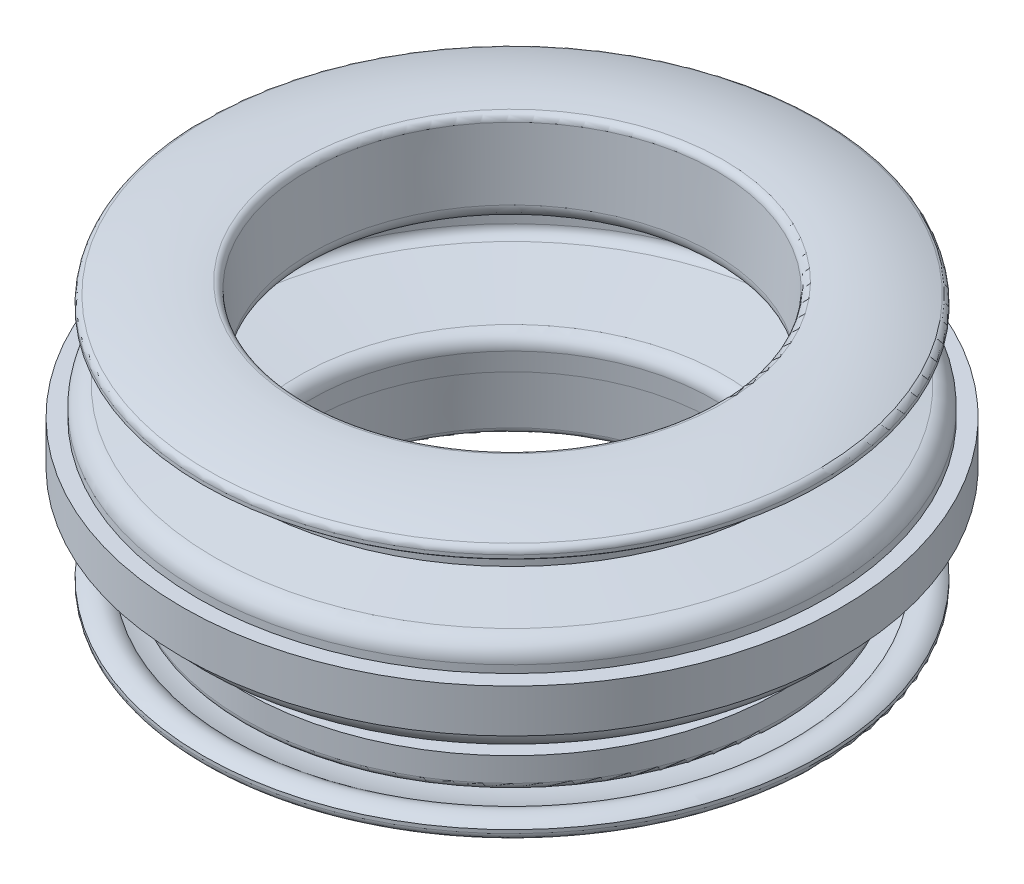
ISO-10303-21;
HEADER;
FILE_DESCRIPTION(('STEP AP214'),'2;1');
FILE_NAME('part.step','',(''),(''),'','','');
FILE_SCHEMA(('AUTOMOTIVE_DESIGN { 1 0 10303 214 1 1 1 1 }'));
ENDSEC;
DATA;
#1=APPLICATION_CONTEXT('core data for automotive mechanical design processes');
#2=APPLICATION_PROTOCOL_DEFINITION('international standard','automotive_design',2000,#1);
#3=PRODUCT_CONTEXT('',#1,'mechanical');
#4=PRODUCT('Part','Part','',(#3));
#5=PRODUCT_RELATED_PRODUCT_CATEGORY('part','',(#4));
#6=PRODUCT_DEFINITION_FORMATION('','',#4);
#7=PRODUCT_DEFINITION_CONTEXT('part definition',#1,'design');
#8=PRODUCT_DEFINITION('design','',#6,#7);
#9=PRODUCT_DEFINITION_SHAPE('','',#8);
#10=(LENGTH_UNIT() NAMED_UNIT(*) SI_UNIT(.MILLI.,.METRE.));
#11=(NAMED_UNIT(*) PLANE_ANGLE_UNIT() SI_UNIT($,.RADIAN.));
#12=(NAMED_UNIT(*) SI_UNIT($,.STERADIAN.) SOLID_ANGLE_UNIT());
#13=UNCERTAINTY_MEASURE_WITH_UNIT(LENGTH_MEASURE(1.E-05),#10,'distance_accuracy_value','');
#14=(GEOMETRIC_REPRESENTATION_CONTEXT(3) GLOBAL_UNCERTAINTY_ASSIGNED_CONTEXT((#13)) GLOBAL_UNIT_ASSIGNED_CONTEXT((#10,
#11,#12)) REPRESENTATION_CONTEXT('',''));
#15=CARTESIAN_POINT('',(0.,0.,0.));
#16=DIRECTION('',(0.,0.,1.));
#17=DIRECTION('',(1.,0.,0.));
#18=AXIS2_PLACEMENT_3D('',#15,#16,#17);
#19=CARTESIAN_POINT('',(0.,-8.08614881640227,0.));
#20=DIRECTION('',(0.,1.,0.));
#21=DIRECTION('',(0.,0.,-1.));
#22=AXIS2_PLACEMENT_3D('',#19,#20,#21);
#23=DEGENERATE_TOROIDAL_SURFACE('',#22,41.247183414883,41.9311614750913,.T.);
#24=CARTESIAN_POINT('',(0.,-47.8006961105615,0.));
#25=DIRECTION('',(0.,-1.,0.));
#26=DIRECTION('',(0.,0.,-1.));
#27=AXIS2_PLACEMENT_3D('',#24,#25,#26);
#28=CIRCLE('',#27,54.6999539797209);
#29=CARTESIAN_POINT('',(0.,-47.8006961105615,-54.6999539797209));
#30=VERTEX_POINT('',#29);
#31=EDGE_CURVE('E53',#30,#30,#28,.F.);
#32=ORIENTED_EDGE('',*,*,#31,.F.);
#33=EDGE_LOOP('',(#32));
#34=FACE_BOUND('',#33,.T.);
#35=CARTESIAN_POINT('',(0.,-49.8867348878114,0.));
#36=DIRECTION('',(0.,-1.,0.));
#37=DIRECTION('',(0.,0.,-1.));
#38=AXIS2_PLACEMENT_3D('',#35,#36,#37);
#39=CIRCLE('',#38,37.9406282986376);
#40=CARTESIAN_POINT('',(0.,-49.8867348878114,-37.9406282986376));
#41=VERTEX_POINT('',#40);
#42=EDGE_CURVE('E65',#41,#41,#39,.T.);
#43=ORIENTED_EDGE('',*,*,#42,.F.);
#44=EDGE_LOOP('',(#43));
#45=FACE_BOUND('',#44,.T.);
#46=ADVANCED_FACE('F42',(#34,#45),#23,.T.);
#47=CARTESIAN_POINT('',(0.,-49.784,0.));
#48=DIRECTION('',(0.,1.,0.));
#49=DIRECTION('',(0.,0.,-1.));
#50=AXIS2_PLACEMENT_3D('',#47,#48,#49);
#51=CYLINDRICAL_SURFACE('',#50,55.5625);
#52=CARTESIAN_POINT('',(0.,-46.5978323383871,0.));
#53=DIRECTION('',(0.,1.,0.));
#54=DIRECTION('',(0.,0.,1.));
#55=AXIS2_PLACEMENT_3D('',#52,#53,#54);
#56=CIRCLE('',#55,55.5625);
#57=CARTESIAN_POINT('',(0.,-46.5978323383871,55.5625));
#58=VERTEX_POINT('',#57);
#59=EDGE_CURVE('E57',#58,#58,#56,.F.);
#60=ORIENTED_EDGE('',*,*,#59,.F.);
#61=EDGE_LOOP('',(#60));
#62=FACE_BOUND('',#61,.T.);
#63=CARTESIAN_POINT('',(0.,-45.974,0.));
#64=DIRECTION('',(0.,-1.,0.));
#65=DIRECTION('',(0.,0.,-1.));
#66=AXIS2_PLACEMENT_3D('',#63,#64,#65);
#67=CIRCLE('',#66,55.5625);
#68=CARTESIAN_POINT('',(0.,-45.974,-55.5625));
#69=VERTEX_POINT('',#68);
#70=EDGE_CURVE('E68',#69,#69,#67,.T.);
#71=ORIENTED_EDGE('',*,*,#70,.T.);
#72=EDGE_LOOP('',(#71));
#73=FACE_BOUND('',#72,.T.);
#74=ADVANCED_FACE('F109',(#62,#73),#51,.T.);
#75=CARTESIAN_POINT('',(0.,-48.8138063314247,0.));
#76=DIRECTION('',(0.,1.,0.));
#77=DIRECTION('',(0.,0.,-1.));
#78=AXIS2_PLACEMENT_3D('',#75,#76,#77);
#79=TOROIDAL_SURFACE('',#78,53.0225,3.81);
#80=ORIENTED_EDGE('',*,*,#70,.F.);
#81=EDGE_LOOP('',(#80));
#82=FACE_BOUND('',#81,.T.);
#83=CARTESIAN_POINT('',(0.,-45.974,0.));
#84=DIRECTION('',(0.,-1.,0.));
#85=DIRECTION('',(0.,0.,-1.));
#86=AXIS2_PLACEMENT_3D('',#83,#84,#85);
#87=CIRCLE('',#86,50.4825);
#88=CARTESIAN_POINT('',(0.,-45.974,-50.4825));
#89=VERTEX_POINT('',#88);
#90=EDGE_CURVE('E75',#89,#89,#87,.T.);
#91=ORIENTED_EDGE('',*,*,#90,.T.);
#92=EDGE_LOOP('',(#91));
#93=FACE_BOUND('',#92,.T.);
#94=ADVANCED_FACE('F114',(#82,#93),#79,.T.);
#95=CARTESIAN_POINT('',(0.,-24.8362895948468,0.));
#96=DIRECTION('',(0.,1.,0.));
#97=DIRECTION('',(0.,0.,-1.));
#98=AXIS2_PLACEMENT_3D('',#95,#96,#97);
#99=TOROIDAL_SURFACE('',#98,43.0459225325699,22.4077104051532);
#100=ORIENTED_EDGE('',*,*,#90,.F.);
#101=EDGE_LOOP('',(#100));
#102=FACE_BOUND('',#101,.T.);
#103=CARTESIAN_POINT('',(0.,-47.244,0.));
#104=DIRECTION('',(0.,-1.,0.));
#105=DIRECTION('',(0.,0.,-1.));
#106=AXIS2_PLACEMENT_3D('',#103,#104,#105);
#107=CIRCLE('',#106,43.0459225325699);
#108=CARTESIAN_POINT('',(0.,-47.244,-43.0459225325699));
#109=VERTEX_POINT('',#108);
#110=EDGE_CURVE('E78',#109,#109,#107,.T.);
#111=ORIENTED_EDGE('',*,*,#110,.T.);
#112=EDGE_LOOP('',(#111));
#113=FACE_BOUND('',#112,.T.);
#114=ADVANCED_FACE('F122',(#102,#113),#99,.F.);
#115=CARTESIAN_POINT('',(0.,-46.228,0.));
#116=DIRECTION('',(0.,1.,0.));
#117=DIRECTION('',(0.,0.,-1.));
#118=AXIS2_PLACEMENT_3D('',#115,#116,#117);
#119=TOROIDAL_SURFACE('',#118,41.91,1.524);
#120=ORIENTED_EDGE('',*,*,#110,.F.);
#121=EDGE_LOOP('',(#120));
#122=FACE_BOUND('',#121,.T.);
#123=CARTESIAN_POINT('',(0.,-45.212,0.));
#124=DIRECTION('',(0.,-1.,0.));
#125=DIRECTION('',(0.,0.,-1.));
#126=AXIS2_PLACEMENT_3D('',#123,#124,#125);
#127=CIRCLE('',#126,43.0459225325699);
#128=CARTESIAN_POINT('',(0.,-45.212,-43.0459225325699));
#129=VERTEX_POINT('',#128);
#130=EDGE_CURVE('E81',#129,#129,#127,.T.);
#131=ORIENTED_EDGE('',*,*,#130,.T.);
#132=EDGE_LOOP('',(#131));
#133=FACE_BOUND('',#132,.T.);
#134=ADVANCED_FACE('F126',(#122,#133),#119,.F.);
#135=CARTESIAN_POINT('',(48.26,-45.212,0.));
#136=DIRECTION('',(0.,-1.,0.));
#137=DIRECTION('',(0.,0.,1.));
#138=AXIS2_PLACEMENT_3D('',#135,#136,#137);
#139=PLANE('',#138);
#140=CARTESIAN_POINT('',(0.,-45.212,0.));
#141=DIRECTION('',(0.,1.,0.));
#142=DIRECTION('',(0.,0.,1.));
#143=AXIS2_PLACEMENT_3D('',#140,#141,#142);
#144=CIRCLE('',#143,46.99);
#145=CARTESIAN_POINT('',(0.,-45.212,46.99));
#146=VERTEX_POINT('',#145);
#147=EDGE_CURVE('E11',#146,#146,#144,.T.);
#148=ORIENTED_EDGE('',*,*,#147,.F.);
#149=EDGE_LOOP('',(#148));
#150=FACE_BOUND('',#149,.T.);
#151=ORIENTED_EDGE('',*,*,#130,.F.);
#152=EDGE_LOOP('',(#151));
#153=FACE_BOUND('',#152,.T.);
#154=ADVANCED_FACE('F130',(#150,#153),#139,.T.);
#155=CARTESIAN_POINT('',(0.,-49.784,0.));
#156=DIRECTION('',(0.,1.,0.));
#157=DIRECTION('',(0.,0.,-1.));
#158=AXIS2_PLACEMENT_3D('',#155,#156,#157);
#159=CYLINDRICAL_SURFACE('',#158,48.26);
#160=CARTESIAN_POINT('',(0.,-43.942,0.));
#161=DIRECTION('',(0.,1.,0.));
#162=DIRECTION('',(0.,0.,1.));
#163=AXIS2_PLACEMENT_3D('',#160,#161,#162);
#164=CIRCLE('',#163,48.26);
#165=CARTESIAN_POINT('',(0.,-43.942,48.26));
#166=VERTEX_POINT('',#165);
#167=EDGE_CURVE('E49',#166,#166,#164,.F.);
#168=ORIENTED_EDGE('',*,*,#167,.F.);
#169=EDGE_LOOP('',(#168));
#170=FACE_BOUND('',#169,.T.);
#171=CARTESIAN_POINT('',(0.,-39.624,0.));
#172=DIRECTION('',(0.,-1.,0.));
#173=DIRECTION('',(0.,0.,-1.));
#174=AXIS2_PLACEMENT_3D('',#171,#172,#173);
#175=CIRCLE('',#174,48.26);
#176=CARTESIAN_POINT('',(0.,-39.624,-48.26));
#177=VERTEX_POINT('',#176);
#178=EDGE_CURVE('E72',#177,#177,#175,.T.);
#179=ORIENTED_EDGE('',*,*,#178,.T.);
#180=EDGE_LOOP('',(#179));
#181=FACE_BOUND('',#180,.T.);
#182=ADVANCED_FACE('F87',(#170,#181),#159,.T.);
#183=CARTESIAN_POINT('',(36.83,-39.624,0.));
#184=DIRECTION('',(0.,1.,0.));
#185=DIRECTION('',(0.,0.,-1.));
#186=AXIS2_PLACEMENT_3D('',#183,#184,#185);
#187=PLANE('',#186);
#188=ORIENTED_EDGE('',*,*,#178,.F.);
#189=EDGE_LOOP('',(#188));
#190=FACE_BOUND('',#189,.T.);
#191=CARTESIAN_POINT('',(0.,-39.624,0.));
#192=DIRECTION('',(0.,-1.,0.));
#193=DIRECTION('',(0.,0.,-1.));
#194=AXIS2_PLACEMENT_3D('',#191,#192,#193);
#195=CIRCLE('',#194,36.2975369624843);
#196=CARTESIAN_POINT('',(0.,-39.624,-36.2975369624843));
#197=VERTEX_POINT('',#196);
#198=EDGE_CURVE('E69',#197,#197,#195,.T.);
#199=ORIENTED_EDGE('',*,*,#198,.T.);
#200=EDGE_LOOP('',(#199));
#201=FACE_BOUND('',#200,.T.);
#202=ADVANCED_FACE('F89',(#190,#201),#187,.T.);
#203=CARTESIAN_POINT('',(0.,-49.784,0.));
#204=DIRECTION('',(0.,-1.,0.));
#205=DIRECTION('',(0.,0.,1.));
#206=AXIS2_PLACEMENT_3D('',#203,#204,#205);
#207=CONICAL_SURFACE('',#206,36.83,0.05235987755983);
#208=CARTESIAN_POINT('',(0.,-48.6871563857552,0.));
#209=DIRECTION('',(0.,-1.,0.));
#210=DIRECTION('',(0.,0.,-1.));
#211=AXIS2_PLACEMENT_3D('',#208,#209,#210);
#212=CIRCLE('',#211,36.7725168619566);
#213=CARTESIAN_POINT('',(0.,-48.6871563857552,-36.7725168619566));
#214=VERTEX_POINT('',#213);
#215=EDGE_CURVE('E62',#214,#214,#212,.F.);
#216=ORIENTED_EDGE('',*,*,#215,.F.);
#217=EDGE_LOOP('',(#216));
#218=FACE_BOUND('',#217,.T.);
#219=ORIENTED_EDGE('',*,*,#198,.F.);
#220=EDGE_LOOP('',(#219));
#221=FACE_BOUND('',#220,.T.);
#222=ADVANCED_FACE('F92',(#218,#221),#207,.F.);
#223=CARTESIAN_POINT('',(0.,-48.6206897213267,0.));
#224=DIRECTION('',(0.,-1.,0.));
#225=DIRECTION('',(0.,0.,1.));
#226=AXIS2_PLACEMENT_3D('',#223,#224,#225);
#227=TOROIDAL_SURFACE('',#226,38.0407763710949,1.27);
#228=ORIENTED_EDGE('',*,*,#215,.T.);
#229=EDGE_LOOP('',(#228));
#230=FACE_BOUND('',#229,.T.);
#231=ORIENTED_EDGE('',*,*,#42,.T.);
#232=EDGE_LOOP('',(#231));
#233=FACE_BOUND('',#232,.T.);
#234=ADVANCED_FACE('F97',(#230,#233),#227,.T.);
#235=CARTESIAN_POINT('',(0.,-46.5978323383871,0.));
#236=DIRECTION('',(0.,-1.,0.));
#237=DIRECTION('',(0.,0.,1.));
#238=AXIS2_PLACEMENT_3D('',#235,#236,#237);
#239=TOROIDAL_SURFACE('',#238,54.2925,1.27);
#240=ORIENTED_EDGE('',*,*,#31,.T.);
#241=EDGE_LOOP('',(#240));
#242=FACE_BOUND('',#241,.T.);
#243=ORIENTED_EDGE('',*,*,#59,.T.);
#244=EDGE_LOOP('',(#243));
#245=FACE_BOUND('',#244,.T.);
#246=ADVANCED_FACE('F103',(#242,#245),#239,.T.);
#247=CARTESIAN_POINT('',(0.,-43.942,0.));
#248=DIRECTION('',(0.,-1.,0.));
#249=DIRECTION('',(0.,0.,1.));
#250=AXIS2_PLACEMENT_3D('',#247,#248,#249);
#251=TOROIDAL_SURFACE('',#250,46.99,1.27);
#252=ORIENTED_EDGE('',*,*,#147,.T.);
#253=EDGE_LOOP('',(#252));
#254=FACE_BOUND('',#253,.T.);
#255=ORIENTED_EDGE('',*,*,#167,.T.);
#256=EDGE_LOOP('',(#255));
#257=FACE_BOUND('',#256,.T.);
#258=ADVANCED_FACE('F44',(#254,#257),#251,.T.);
#259=CLOSED_SHELL('',(#46,#74,#94,#114,#134,#154,#182,#202,#222,#234,#246,#258));
#260=MANIFOLD_SOLID_BREP('B2',#259);
#261=CARTESIAN_POINT('',(0.,-41.6978511835977,0.));
#262=DIRECTION('',(0.,-1.,0.));
#263=DIRECTION('',(0.,0.,-1.));
#264=AXIS2_PLACEMENT_3D('',#261,#262,#263);
#265=DEGENERATE_TOROIDAL_SURFACE('',#264,41.247183414883,41.9311614750913,.T.);
#266=CARTESIAN_POINT('',(0.,-1.98330388943848,0.));
#267=DIRECTION('',(0.,-1.,0.));
#268=DIRECTION('',(0.,0.,-1.));
#269=AXIS2_PLACEMENT_3D('',#266,#267,#268);
#270=CIRCLE('',#269,54.6999539797209);
#271=CARTESIAN_POINT('',(0.,-1.98330388943848,-54.6999539797209));
#272=VERTEX_POINT('',#271);
#273=EDGE_CURVE('E238',#272,#272,#270,.F.);
#274=ORIENTED_EDGE('',*,*,#273,.T.);
#275=EDGE_LOOP('',(#274));
#276=FACE_BOUND('',#275,.T.);
#277=CARTESIAN_POINT('',(0.,0.102734887811352,0.));
#278=DIRECTION('',(0.,-1.,0.));
#279=DIRECTION('',(0.,0.,-1.));
#280=AXIS2_PLACEMENT_3D('',#277,#278,#279);
#281=CIRCLE('',#280,37.9406282986376);
#282=CARTESIAN_POINT('',(0.,0.102734887811352,-37.9406282986376));
#283=VERTEX_POINT('',#282);
#284=EDGE_CURVE('E249',#283,#283,#281,.T.);
#285=ORIENTED_EDGE('',*,*,#284,.T.);
#286=EDGE_LOOP('',(#285));
#287=FACE_BOUND('',#286,.T.);
#288=ADVANCED_FACE('F223',(#276,#287),#265,.T.);
#289=CARTESIAN_POINT('',(0.,0.,0.));
#290=DIRECTION('',(0.,-1.,0.));
#291=DIRECTION('',(0.,0.,-1.));
#292=AXIS2_PLACEMENT_3D('',#289,#290,#291);
#293=CYLINDRICAL_SURFACE('',#292,55.5625);
#294=CARTESIAN_POINT('',(0.,-3.18616766161288,0.));
#295=DIRECTION('',(0.,1.,0.));
#296=DIRECTION('',(0.,0.,1.));
#297=AXIS2_PLACEMENT_3D('',#294,#295,#296);
#298=CIRCLE('',#297,55.5625);
#299=CARTESIAN_POINT('',(0.,-3.18616766161288,55.5625));
#300=VERTEX_POINT('',#299);
#301=EDGE_CURVE('E243',#300,#300,#298,.F.);
#302=ORIENTED_EDGE('',*,*,#301,.T.);
#303=EDGE_LOOP('',(#302));
#304=FACE_BOUND('',#303,.T.);
#305=CARTESIAN_POINT('',(0.,-3.81,0.));
#306=DIRECTION('',(0.,-1.,0.));
#307=DIRECTION('',(0.,0.,-1.));
#308=AXIS2_PLACEMENT_3D('',#305,#306,#307);
#309=CIRCLE('',#308,55.5625);
#310=CARTESIAN_POINT('',(0.,-3.81,-55.5625));
#311=VERTEX_POINT('',#310);
#312=EDGE_CURVE('E252',#311,#311,#309,.T.);
#313=ORIENTED_EDGE('',*,*,#312,.F.);
#314=EDGE_LOOP('',(#313));
#315=FACE_BOUND('',#314,.T.);
#316=ADVANCED_FACE('F418',(#304,#315),#293,.T.);
#317=CARTESIAN_POINT('',(0.,-0.970193668575267,0.));
#318=DIRECTION('',(0.,-1.,0.));
#319=DIRECTION('',(0.,0.,-1.));
#320=AXIS2_PLACEMENT_3D('',#317,#318,#319);
#321=TOROIDAL_SURFACE('',#320,53.0225,3.81);
#322=ORIENTED_EDGE('',*,*,#312,.T.);
#323=EDGE_LOOP('',(#322));
#324=FACE_BOUND('',#323,.T.);
#325=CARTESIAN_POINT('',(0.,-3.81,0.));
#326=DIRECTION('',(0.,-1.,0.));
#327=DIRECTION('',(0.,0.,-1.));
#328=AXIS2_PLACEMENT_3D('',#325,#326,#327);
#329=CIRCLE('',#328,50.4825);
#330=CARTESIAN_POINT('',(0.,-3.81,-50.4825));
#331=VERTEX_POINT('',#330);
#332=EDGE_CURVE('E255',#331,#331,#329,.T.);
#333=ORIENTED_EDGE('',*,*,#332,.F.);
#334=EDGE_LOOP('',(#333));
#335=FACE_BOUND('',#334,.T.);
#336=ADVANCED_FACE('F424',(#324,#335),#321,.T.);
#337=CARTESIAN_POINT('',(0.,-24.9477104051532,0.));
#338=DIRECTION('',(0.,-1.,0.));
#339=DIRECTION('',(0.,0.,-1.));
#340=AXIS2_PLACEMENT_3D('',#337,#338,#339);
#341=TOROIDAL_SURFACE('',#340,43.0459225325699,22.4077104051532);
#342=ORIENTED_EDGE('',*,*,#332,.T.);
#343=EDGE_LOOP('',(#342));
#344=FACE_BOUND('',#343,.T.);
#345=CARTESIAN_POINT('',(0.,-2.54,0.));
#346=DIRECTION('',(0.,-1.,0.));
#347=DIRECTION('',(0.,0.,-1.));
#348=AXIS2_PLACEMENT_3D('',#345,#346,#347);
#349=CIRCLE('',#348,43.0459225325699);
#350=CARTESIAN_POINT('',(0.,-2.54,-43.0459225325699));
#351=VERTEX_POINT('',#350);
#352=EDGE_CURVE('E258',#351,#351,#349,.T.);
#353=ORIENTED_EDGE('',*,*,#352,.F.);
#354=EDGE_LOOP('',(#353));
#355=FACE_BOUND('',#354,.T.);
#356=ADVANCED_FACE('F453',(#344,#355),#341,.F.);
#357=CARTESIAN_POINT('',(0.,-3.556,0.));
#358=DIRECTION('',(0.,-1.,0.));
#359=DIRECTION('',(0.,0.,-1.));
#360=AXIS2_PLACEMENT_3D('',#357,#358,#359);
#361=TOROIDAL_SURFACE('',#360,41.91,1.524);
#362=ORIENTED_EDGE('',*,*,#352,.T.);
#363=EDGE_LOOP('',(#362));
#364=FACE_BOUND('',#363,.T.);
#365=CARTESIAN_POINT('',(0.,-4.572,0.));
#366=DIRECTION('',(0.,-1.,0.));
#367=DIRECTION('',(0.,0.,-1.));
#368=AXIS2_PLACEMENT_3D('',#365,#366,#367);
#369=CIRCLE('',#368,43.0459225325699);
#370=CARTESIAN_POINT('',(0.,-4.572,-43.0459225325699));
#371=VERTEX_POINT('',#370);
#372=EDGE_CURVE('E261',#371,#371,#369,.T.);
#373=ORIENTED_EDGE('',*,*,#372,.F.);
#374=EDGE_LOOP('',(#373));
#375=FACE_BOUND('',#374,.T.);
#376=ADVANCED_FACE('F458',(#364,#375),#361,.F.);
#377=CARTESIAN_POINT('',(48.26,-4.572,0.));
#378=DIRECTION('',(0.,1.,0.));
#379=DIRECTION('',(0.,0.,1.));
#380=AXIS2_PLACEMENT_3D('',#377,#378,#379);
#381=PLANE('',#380);
#382=CARTESIAN_POINT('',(0.,-4.572,0.));
#383=DIRECTION('',(0.,1.,0.));
#384=DIRECTION('',(0.,0.,1.));
#385=AXIS2_PLACEMENT_3D('',#382,#383,#384);
#386=CIRCLE('',#385,46.99);
#387=CARTESIAN_POINT('',(0.,-4.572,46.99));
#388=VERTEX_POINT('',#387);
#389=EDGE_CURVE('E230',#388,#388,#386,.T.);
#390=ORIENTED_EDGE('',*,*,#389,.T.);
#391=EDGE_LOOP('',(#390));
#392=FACE_BOUND('',#391,.T.);
#393=ORIENTED_EDGE('',*,*,#372,.T.);
#394=EDGE_LOOP('',(#393));
#395=FACE_BOUND('',#394,.T.);
#396=ADVANCED_FACE('F464',(#392,#395),#381,.T.);
#397=CARTESIAN_POINT('',(0.,0.,0.));
#398=DIRECTION('',(0.,-1.,0.));
#399=DIRECTION('',(0.,0.,-1.));
#400=AXIS2_PLACEMENT_3D('',#397,#398,#399);
#401=CYLINDRICAL_SURFACE('',#400,48.26);
#402=CARTESIAN_POINT('',(0.,-5.842,0.));
#403=DIRECTION('',(0.,1.,0.));
#404=DIRECTION('',(0.,0.,1.));
#405=AXIS2_PLACEMENT_3D('',#402,#403,#404);
#406=CIRCLE('',#405,48.26);
#407=CARTESIAN_POINT('',(0.,-5.842,48.26));
#408=VERTEX_POINT('',#407);
#409=EDGE_CURVE('E234',#408,#408,#406,.F.);
#410=ORIENTED_EDGE('',*,*,#409,.T.);
#411=EDGE_LOOP('',(#410));
#412=FACE_BOUND('',#411,.T.);
#413=CARTESIAN_POINT('',(0.,-10.16,0.));
#414=DIRECTION('',(0.,-1.,0.));
#415=DIRECTION('',(0.,0.,-1.));
#416=AXIS2_PLACEMENT_3D('',#413,#414,#415);
#417=CIRCLE('',#416,48.26);
#418=CARTESIAN_POINT('',(0.,-10.16,-48.26));
#419=VERTEX_POINT('',#418);
#420=EDGE_CURVE('E264',#419,#419,#417,.T.);
#421=ORIENTED_EDGE('',*,*,#420,.F.);
#422=EDGE_LOOP('',(#421));
#423=FACE_BOUND('',#422,.T.);
#424=ADVANCED_FACE('F469',(#412,#423),#401,.T.);
#425=CARTESIAN_POINT('',(36.83,-10.16,0.));
#426=DIRECTION('',(0.,-1.,0.));
#427=DIRECTION('',(0.,0.,-1.));
#428=AXIS2_PLACEMENT_3D('',#425,#426,#427);
#429=PLANE('',#428);
#430=CARTESIAN_POINT('',(0.,-10.16,0.));
#431=DIRECTION('',(0.,-1.,0.));
#432=DIRECTION('',(0.,0.,-1.));
#433=AXIS2_PLACEMENT_3D('',#430,#431,#432);
#434=CIRCLE('',#433,38.8375369624843);
#435=CARTESIAN_POINT('',(0.,-10.16,-38.8375369624843));
#436=VERTEX_POINT('',#435);
#437=EDGE_CURVE('E41',#436,#436,#434,.T.);
#438=ORIENTED_EDGE('',*,*,#437,.F.);
#439=EDGE_LOOP('',(#438));
#440=FACE_BOUND('',#439,.T.);
#441=ORIENTED_EDGE('',*,*,#420,.T.);
#442=EDGE_LOOP('',(#441));
#443=FACE_BOUND('',#442,.T.);
#444=ADVANCED_FACE('F434',(#440,#443),#429,.T.);
#445=CARTESIAN_POINT('',(0.,0.,0.));
#446=DIRECTION('',(0.,1.,0.));
#447=DIRECTION('',(0.,0.,1.));
#448=AXIS2_PLACEMENT_3D('',#445,#446,#447);
#449=CONICAL_SURFACE('',#448,36.83,0.05235987755983);
#450=CARTESIAN_POINT('',(0.,-1.09684361424478,0.));
#451=DIRECTION('',(0.,-1.,0.));
#452=DIRECTION('',(0.,0.,-1.));
#453=AXIS2_PLACEMENT_3D('',#450,#451,#452);
#454=CIRCLE('',#453,36.7725168619566);
#455=CARTESIAN_POINT('',(0.,-1.09684361424478,-36.7725168619566));
#456=VERTEX_POINT('',#455);
#457=EDGE_CURVE('E246',#456,#456,#454,.F.);
#458=ORIENTED_EDGE('',*,*,#457,.T.);
#459=EDGE_LOOP('',(#458));
#460=FACE_BOUND('',#459,.T.);
#461=CARTESIAN_POINT('',(0.,-13.5156304286955,0.));
#462=DIRECTION('',(0.,1.,0.));
#463=DIRECTION('',(0.,0.,1.));
#464=AXIS2_PLACEMENT_3D('',#461,#462,#463);
#465=CIRCLE('',#464,36.1216758236218);
#466=CARTESIAN_POINT('',(0.,-13.5156304286955,36.1216758236218));
#467=VERTEX_POINT('',#466);
#468=EDGE_CURVE('E276',#467,#467,#465,.T.);
#469=ORIENTED_EDGE('',*,*,#468,.F.);
#470=EDGE_LOOP('',(#469));
#471=FACE_BOUND('',#470,.T.);
#472=ADVANCED_FACE('F430',(#460,#471),#449,.F.);
#473=CARTESIAN_POINT('',(0.,-1.16331027867326,0.));
#474=DIRECTION('',(0.,1.,0.));
#475=DIRECTION('',(0.,0.,1.));
#476=AXIS2_PLACEMENT_3D('',#473,#474,#475);
#477=TOROIDAL_SURFACE('',#476,38.0407763710949,1.27);
#478=ORIENTED_EDGE('',*,*,#457,.F.);
#479=EDGE_LOOP('',(#478));
#480=FACE_BOUND('',#479,.T.);
#481=ORIENTED_EDGE('',*,*,#284,.F.);
#482=EDGE_LOOP('',(#481));
#483=FACE_BOUND('',#482,.T.);
#484=ADVANCED_FACE('F433',(#480,#483),#477,.T.);
#485=CARTESIAN_POINT('',(0.,-3.18616766161288,0.));
#486=DIRECTION('',(0.,1.,0.));
#487=DIRECTION('',(0.,0.,1.));
#488=AXIS2_PLACEMENT_3D('',#485,#486,#487);
#489=TOROIDAL_SURFACE('',#488,54.2925,1.27);
#490=ORIENTED_EDGE('',*,*,#273,.F.);
#491=EDGE_LOOP('',(#490));
#492=FACE_BOUND('',#491,.T.);
#493=ORIENTED_EDGE('',*,*,#301,.F.);
#494=EDGE_LOOP('',(#493));
#495=FACE_BOUND('',#494,.T.);
#496=ADVANCED_FACE('F437',(#492,#495),#489,.T.);
#497=CARTESIAN_POINT('',(0.,-5.842,0.));
#498=DIRECTION('',(0.,1.,0.));
#499=DIRECTION('',(0.,0.,1.));
#500=AXIS2_PLACEMENT_3D('',#497,#498,#499);
#501=TOROIDAL_SURFACE('',#500,46.99,1.27);
#502=ORIENTED_EDGE('',*,*,#389,.F.);
#503=EDGE_LOOP('',(#502));
#504=FACE_BOUND('',#503,.T.);
#505=ORIENTED_EDGE('',*,*,#409,.F.);
#506=EDGE_LOOP('',(#505));
#507=FACE_BOUND('',#506,.T.);
#508=ADVANCED_FACE('F225',(#504,#507),#501,.T.);
#509=CARTESIAN_POINT('',(0.,0.,0.));
#510=DIRECTION('',(0.,1.,0.));
#511=DIRECTION('',(0.,0.,1.));
#512=AXIS2_PLACEMENT_3D('',#509,#510,#511);
#513=CYLINDRICAL_SURFACE('',#512,59.2604292563378);
#514=CARTESIAN_POINT('',(0.,-21.0051938165436,0.));
#515=DIRECTION('',(0.,1.,0.));
#516=DIRECTION('',(0.,0.,1.));
#517=AXIS2_PLACEMENT_3D('',#514,#515,#516);
#518=CIRCLE('',#517,59.2604292563378);
#519=CARTESIAN_POINT('',(0.,-21.0051938165436,59.2604292563378));
#520=VERTEX_POINT('',#519);
#521=EDGE_CURVE('E294',#520,#520,#518,.T.);
#522=ORIENTED_EDGE('',*,*,#521,.F.);
#523=EDGE_LOOP('',(#522));
#524=FACE_BOUND('',#523,.T.);
#525=CARTESIAN_POINT('',(0.,-28.7788061834564,0.));
#526=DIRECTION('',(0.,1.,0.));
#527=DIRECTION('',(0.,0.,1.));
#528=AXIS2_PLACEMENT_3D('',#525,#526,#527);
#529=CIRCLE('',#528,59.2604292563378);
#530=CARTESIAN_POINT('',(0.,-28.7788061834564,59.2604292563378));
#531=VERTEX_POINT('',#530);
#532=EDGE_CURVE('E330',#531,#531,#529,.T.);
#533=ORIENTED_EDGE('',*,*,#532,.T.);
#534=EDGE_LOOP('',(#533));
#535=FACE_BOUND('',#534,.T.);
#536=ADVANCED_FACE('F334',(#524,#535),#513,.T.);
#537=CARTESIAN_POINT('',(0.,0.,0.));
#538=DIRECTION('',(0.,1.,0.));
#539=DIRECTION('',(0.,0.,1.));
#540=AXIS2_PLACEMENT_3D('',#537,#538,#539);
#541=CYLINDRICAL_SURFACE('',#540,54.5175579136274);
#542=CARTESIAN_POINT('',(0.,-20.3326467556144,0.));
#543=DIRECTION('',(0.,1.,0.));
#544=DIRECTION('',(0.,0.,1.));
#545=AXIS2_PLACEMENT_3D('',#542,#543,#544);
#546=CIRCLE('',#545,54.5175579136274);
#547=CARTESIAN_POINT('',(0.,-20.3326467556144,54.5175579136274));
#548=VERTEX_POINT('',#547);
#549=EDGE_CURVE('E267',#548,#548,#546,.T.);
#550=ORIENTED_EDGE('',*,*,#549,.T.);
#551=EDGE_LOOP('',(#550));
#552=FACE_BOUND('',#551,.T.);
#553=CARTESIAN_POINT('',(0.,-29.4513532443856,0.));
#554=DIRECTION('',(0.,1.,0.));
#555=DIRECTION('',(0.,0.,1.));
#556=AXIS2_PLACEMENT_3D('',#553,#554,#555);
#557=CIRCLE('',#556,54.5175579136274);
#558=CARTESIAN_POINT('',(0.,-29.4513532443856,54.5175579136274));
#559=VERTEX_POINT('',#558);
#560=EDGE_CURVE('E297',#559,#559,#557,.T.);
#561=ORIENTED_EDGE('',*,*,#560,.F.);
#562=EDGE_LOOP('',(#561));
#563=FACE_BOUND('',#562,.T.);
#564=ADVANCED_FACE('F403',(#552,#563),#541,.F.);
#565=CARTESIAN_POINT('',(0.,-20.3326467556144,0.));
#566=DIRECTION('',(0.,1.,0.));
#567=DIRECTION('',(0.,0.,1.));
#568=AXIS2_PLACEMENT_3D('',#565,#566,#567);
#569=TOROIDAL_SURFACE('',#568,52.7669659205668,1.75059199306054);
#570=CARTESIAN_POINT('',(0.,-18.6055501848726,0.));
#571=DIRECTION('',(0.,1.,0.));
#572=DIRECTION('',(0.,0.,1.));
#573=AXIS2_PLACEMENT_3D('',#570,#571,#572);
#574=CIRCLE('',#573,53.052815114198);
#575=CARTESIAN_POINT('',(0.,-18.6055501848726,53.052815114198));
#576=VERTEX_POINT('',#575);
#577=EDGE_CURVE('E270',#576,#576,#574,.T.);
#578=ORIENTED_EDGE('',*,*,#577,.T.);
#579=EDGE_LOOP('',(#578));
#580=FACE_BOUND('',#579,.T.);
#581=ORIENTED_EDGE('',*,*,#549,.F.);
#582=EDGE_LOOP('',(#581));
#583=FACE_BOUND('',#582,.T.);
#584=ADVANCED_FACE('F405',(#580,#583),#569,.F.);
#585=CARTESIAN_POINT('',(0.,-18.6055501848726,0.));
#586=DIRECTION('',(0.,-1.,0.));
#587=DIRECTION('',(0.,0.,-1.));
#588=AXIS2_PLACEMENT_3D('',#585,#586,#587);
#589=CONICAL_SURFACE('',#588,53.052815114198,1.4067747080575);
#590=CARTESIAN_POINT('',(0.,-16.1544733624598,0.));
#591=DIRECTION('',(0.,1.,0.));
#592=DIRECTION('',(0.,0.,1.));
#593=AXIS2_PLACEMENT_3D('',#590,#591,#592);
#594=CIRCLE('',#593,38.2434454572894);
#595=CARTESIAN_POINT('',(0.,-16.1544733624598,38.2434454572894));
#596=VERTEX_POINT('',#595);
#597=EDGE_CURVE('E273',#596,#596,#594,.T.);
#598=ORIENTED_EDGE('',*,*,#597,.T.);
#599=EDGE_LOOP('',(#598));
#600=FACE_BOUND('',#599,.T.);
#601=ORIENTED_EDGE('',*,*,#577,.F.);
#602=EDGE_LOOP('',(#601));
#603=FACE_BOUND('',#602,.T.);
#604=ADVANCED_FACE('F412',(#600,#603),#589,.F.);
#605=CARTESIAN_POINT('',(0.,-13.6485637575525,0.));
#606=DIRECTION('',(0.,1.,0.));
#607=DIRECTION('',(0.,0.,1.));
#608=AXIS2_PLACEMENT_3D('',#605,#606,#607);
#609=TOROIDAL_SURFACE('',#608,38.6581948418984,2.54);
#610=ORIENTED_EDGE('',*,*,#468,.T.);
#611=EDGE_LOOP('',(#610));
#612=FACE_BOUND('',#611,.T.);
#613=ORIENTED_EDGE('',*,*,#597,.F.);
#614=EDGE_LOOP('',(#613));
#615=FACE_BOUND('',#614,.T.);
#616=ADVANCED_FACE('F655',(#612,#615),#609,.T.);
#617=CARTESIAN_POINT('',(0.,0.,0.));
#618=DIRECTION('',(0.,1.,0.));
#619=DIRECTION('',(0.,0.,1.));
#620=AXIS2_PLACEMENT_3D('',#617,#618,#619);
#621=CYLINDRICAL_SURFACE('',#620,38.8375369624843);
#622=CARTESIAN_POINT('',(0.,-12.0626245120228,0.));
#623=DIRECTION('',(0.,1.,0.));
#624=DIRECTION('',(0.,0.,1.));
#625=AXIS2_PLACEMENT_3D('',#622,#623,#624);
#626=CIRCLE('',#625,38.8375369624843);
#627=CARTESIAN_POINT('',(0.,-12.0626245120228,38.8375369624843));
#628=VERTEX_POINT('',#627);
#629=EDGE_CURVE('E279',#628,#628,#626,.T.);
#630=ORIENTED_EDGE('',*,*,#629,.T.);
#631=EDGE_LOOP('',(#630));
#632=FACE_BOUND('',#631,.T.);
#633=ORIENTED_EDGE('',*,*,#437,.T.);
#634=EDGE_LOOP('',(#633));
#635=FACE_BOUND('',#634,.T.);
#636=ADVANCED_FACE('F647',(#632,#635),#621,.T.);
#637=CARTESIAN_POINT('',(0.,-12.0626245120228,0.));
#638=DIRECTION('',(0.,1.,0.));
#639=DIRECTION('',(0.,0.,1.));
#640=AXIS2_PLACEMENT_3D('',#637,#638,#639);
#641=TOROIDAL_SURFACE('',#640,40.7425369624843,1.905);
#642=CARTESIAN_POINT('',(0.,-13.9420567157032,0.));
#643=DIRECTION('',(0.,1.,0.));
#644=DIRECTION('',(0.,0.,1.));
#645=AXIS2_PLACEMENT_3D('',#642,#643,#644);
#646=CIRCLE('',#645,40.4314749240276);
#647=CARTESIAN_POINT('',(0.,-13.9420567157032,40.4314749240276));
#648=VERTEX_POINT('',#647);
#649=EDGE_CURVE('E282',#648,#648,#646,.T.);
#650=ORIENTED_EDGE('',*,*,#649,.T.);
#651=EDGE_LOOP('',(#650));
#652=FACE_BOUND('',#651,.T.);
#653=ORIENTED_EDGE('',*,*,#629,.F.);
#654=EDGE_LOOP('',(#653));
#655=FACE_BOUND('',#654,.T.);
#656=ADVANCED_FACE('F639',(#652,#655),#641,.F.);
#657=CARTESIAN_POINT('',(0.,-13.9420567157032,0.));
#658=DIRECTION('',(0.,-1.,0.));
#659=DIRECTION('',(0.,0.,-1.));
#660=AXIS2_PLACEMENT_3D('',#657,#658,#659);
#661=CONICAL_SURFACE('',#660,40.4314749240276,1.4067747080575);
#662=CARTESIAN_POINT('',(0.,-16.104875129868,0.));
#663=DIRECTION('',(0.,1.,0.));
#664=DIRECTION('',(0.,0.,1.));
#665=AXIS2_PLACEMENT_3D('',#662,#663,#664);
#666=CIRCLE('',#665,53.4991915713602);
#667=CARTESIAN_POINT('',(0.,-16.104875129868,53.4991915713602));
#668=VERTEX_POINT('',#667);
#669=EDGE_CURVE('E285',#668,#668,#666,.T.);
#670=ORIENTED_EDGE('',*,*,#669,.T.);
#671=EDGE_LOOP('',(#670));
#672=FACE_BOUND('',#671,.T.);
#673=ORIENTED_EDGE('',*,*,#649,.F.);
#674=EDGE_LOOP('',(#673));
#675=FACE_BOUND('',#674,.T.);
#676=ADVANCED_FACE('F631',(#672,#675),#661,.T.);
#677=CARTESIAN_POINT('',(0.,-19.6371157406611,0.));
#678=DIRECTION('',(0.,1.,0.));
#679=DIRECTION('',(0.,0.,1.));
#680=AXIS2_PLACEMENT_3D('',#677,#678,#679);
#681=TOROIDAL_SURFACE('',#680,52.9145756631293,3.58029321322894);
#682=CARTESIAN_POINT('',(0.,-19.6371157406611,0.));
#683=DIRECTION('',(0.,1.,0.));
#684=DIRECTION('',(0.,0.,1.));
#685=AXIS2_PLACEMENT_3D('',#682,#683,#684);
#686=CIRCLE('',#685,56.4948688763583);
#687=CARTESIAN_POINT('',(0.,-19.6371157406611,56.4948688763583));
#688=VERTEX_POINT('',#687);
#689=EDGE_CURVE('E288',#688,#688,#686,.T.);
#690=ORIENTED_EDGE('',*,*,#689,.T.);
#691=EDGE_LOOP('',(#690));
#692=FACE_BOUND('',#691,.T.);
#693=ORIENTED_EDGE('',*,*,#669,.F.);
#694=EDGE_LOOP('',(#693));
#695=FACE_BOUND('',#694,.T.);
#696=ADVANCED_FACE('F623',(#692,#695),#681,.T.);
#697=CARTESIAN_POINT('',(0.,0.,0.));
#698=DIRECTION('',(0.,1.,0.));
#699=DIRECTION('',(0.,0.,1.));
#700=AXIS2_PLACEMENT_3D('',#697,#698,#699);
#701=CYLINDRICAL_SURFACE('',#700,56.4948688763583);
#702=CARTESIAN_POINT('',(0.,-21.0051938165436,0.));
#703=DIRECTION('',(0.,1.,0.));
#704=DIRECTION('',(0.,0.,1.));
#705=AXIS2_PLACEMENT_3D('',#702,#703,#704);
#706=CIRCLE('',#705,56.4948688763583);
#707=CARTESIAN_POINT('',(0.,-21.0051938165436,56.4948688763583));
#708=VERTEX_POINT('',#707);
#709=EDGE_CURVE('E291',#708,#708,#706,.T.);
#710=ORIENTED_EDGE('',*,*,#709,.T.);
#711=EDGE_LOOP('',(#710));
#712=FACE_BOUND('',#711,.T.);
#713=ORIENTED_EDGE('',*,*,#689,.F.);
#714=EDGE_LOOP('',(#713));
#715=FACE_BOUND('',#714,.T.);
#716=ADVANCED_FACE('F618',(#712,#715),#701,.T.);
#717=CARTESIAN_POINT('',(-56.4948688763583,-21.0051938165436,0.));
#718=DIRECTION('',(0.,1.,0.));
#719=DIRECTION('',(0.,0.,1.));
#720=AXIS2_PLACEMENT_3D('',#717,#718,#719);
#721=PLANE('',#720);
#722=ORIENTED_EDGE('',*,*,#521,.T.);
#723=EDGE_LOOP('',(#722));
#724=FACE_BOUND('',#723,.T.);
#725=ORIENTED_EDGE('',*,*,#709,.F.);
#726=EDGE_LOOP('',(#725));
#727=FACE_BOUND('',#726,.T.);
#728=ADVANCED_FACE('F399',(#724,#727),#721,.T.);
#729=CARTESIAN_POINT('',(0.,-29.4513532443856,0.));
#730=DIRECTION('',(0.,-1.,0.));
#731=DIRECTION('',(0.,0.,1.));
#732=AXIS2_PLACEMENT_3D('',#729,#730,#731);
#733=TOROIDAL_SURFACE('',#732,52.7669659205668,1.75059199306054);
#734=CARTESIAN_POINT('',(0.,-31.1784498151274,0.));
#735=DIRECTION('',(0.,1.,0.));
#736=DIRECTION('',(0.,0.,1.));
#737=AXIS2_PLACEMENT_3D('',#734,#735,#736);
#738=CIRCLE('',#737,53.052815114198);
#739=CARTESIAN_POINT('',(0.,-31.1784498151274,53.052815114198));
#740=VERTEX_POINT('',#739);
#741=EDGE_CURVE('E300',#740,#740,#738,.T.);
#742=ORIENTED_EDGE('',*,*,#741,.F.);
#743=EDGE_LOOP('',(#742));
#744=FACE_BOUND('',#743,.T.);
#745=ORIENTED_EDGE('',*,*,#560,.T.);
#746=EDGE_LOOP('',(#745));
#747=FACE_BOUND('',#746,.T.);
#748=ADVANCED_FACE('F393',(#744,#747),#733,.F.);
#749=CARTESIAN_POINT('',(0.,-31.1784498151274,0.));
#750=DIRECTION('',(0.,1.,0.));
#751=DIRECTION('',(0.,0.,-1.));
#752=AXIS2_PLACEMENT_3D('',#749,#750,#751);
#753=CONICAL_SURFACE('',#752,53.052815114198,1.4067747080575);
#754=CARTESIAN_POINT('',(0.,-33.6295266375402,0.));
#755=DIRECTION('',(0.,1.,0.));
#756=DIRECTION('',(0.,0.,1.));
#757=AXIS2_PLACEMENT_3D('',#754,#755,#756);
#758=CIRCLE('',#757,38.2434454572894);
#759=CARTESIAN_POINT('',(0.,-33.6295266375402,38.2434454572894));
#760=VERTEX_POINT('',#759);
#761=EDGE_CURVE('E303',#760,#760,#758,.T.);
#762=ORIENTED_EDGE('',*,*,#761,.F.);
#763=EDGE_LOOP('',(#762));
#764=FACE_BOUND('',#763,.T.);
#765=ORIENTED_EDGE('',*,*,#741,.T.);
#766=EDGE_LOOP('',(#765));
#767=FACE_BOUND('',#766,.T.);
#768=ADVANCED_FACE('F387',(#764,#767),#753,.F.);
#769=CARTESIAN_POINT('',(0.,-36.1354362424475,0.));
#770=DIRECTION('',(0.,-1.,0.));
#771=DIRECTION('',(0.,0.,1.));
#772=AXIS2_PLACEMENT_3D('',#769,#770,#771);
#773=TOROIDAL_SURFACE('',#772,38.6581948418984,2.54);
#774=CARTESIAN_POINT('',(0.,-36.2683695713045,0.));
#775=DIRECTION('',(0.,1.,0.));
#776=DIRECTION('',(0.,0.,1.));
#777=AXIS2_PLACEMENT_3D('',#774,#775,#776);
#778=CIRCLE('',#777,36.1216758236218);
#779=CARTESIAN_POINT('',(0.,-36.2683695713045,36.1216758236218));
#780=VERTEX_POINT('',#779);
#781=EDGE_CURVE('E306',#780,#780,#778,.T.);
#782=ORIENTED_EDGE('',*,*,#781,.F.);
#783=EDGE_LOOP('',(#782));
#784=FACE_BOUND('',#783,.T.);
#785=ORIENTED_EDGE('',*,*,#761,.T.);
#786=EDGE_LOOP('',(#785));
#787=FACE_BOUND('',#786,.T.);
#788=ADVANCED_FACE('F381',(#784,#787),#773,.T.);
#789=CARTESIAN_POINT('',(0.,-36.2683695713045,0.));
#790=DIRECTION('',(0.,-1.,0.));
#791=DIRECTION('',(0.,0.,1.));
#792=AXIS2_PLACEMENT_3D('',#789,#790,#791);
#793=CONICAL_SURFACE('',#792,36.1216758236218,0.0523598775598288);
#794=CARTESIAN_POINT('',(0.,-39.624,0.));
#795=DIRECTION('',(0.,1.,0.));
#796=DIRECTION('',(0.,0.,1.));
#797=AXIS2_PLACEMENT_3D('',#794,#795,#796);
#798=CIRCLE('',#797,36.2975369624843);
#799=CARTESIAN_POINT('',(0.,-39.624,36.2975369624843));
#800=VERTEX_POINT('',#799);
#801=EDGE_CURVE('E309',#800,#800,#798,.T.);
#802=ORIENTED_EDGE('',*,*,#801,.F.);
#803=EDGE_LOOP('',(#802));
#804=FACE_BOUND('',#803,.T.);
#805=ORIENTED_EDGE('',*,*,#781,.T.);
#806=EDGE_LOOP('',(#805));
#807=FACE_BOUND('',#806,.T.);
#808=ADVANCED_FACE('F375',(#804,#807),#793,.F.);
#809=CARTESIAN_POINT('',(-36.2975369624843,-39.624,0.));
#810=DIRECTION('',(0.,-1.,0.));
#811=DIRECTION('',(0.,0.,1.));
#812=AXIS2_PLACEMENT_3D('',#809,#810,#811);
#813=PLANE('',#812);
#814=CARTESIAN_POINT('',(0.,-39.624,0.));
#815=DIRECTION('',(0.,1.,0.));
#816=DIRECTION('',(0.,0.,1.));
#817=AXIS2_PLACEMENT_3D('',#814,#815,#816);
#818=CIRCLE('',#817,38.8375369624843);
#819=CARTESIAN_POINT('',(0.,-39.624,38.8375369624843));
#820=VERTEX_POINT('',#819);
#821=EDGE_CURVE('E312',#820,#820,#818,.T.);
#822=ORIENTED_EDGE('',*,*,#821,.F.);
#823=EDGE_LOOP('',(#822));
#824=FACE_BOUND('',#823,.T.);
#825=ORIENTED_EDGE('',*,*,#801,.T.);
#826=EDGE_LOOP('',(#825));
#827=FACE_BOUND('',#826,.T.);
#828=ADVANCED_FACE('F369',(#824,#827),#813,.T.);
#829=CARTESIAN_POINT('',(0.,-49.784,0.));
#830=DIRECTION('',(0.,-1.,0.));
#831=DIRECTION('',(0.,0.,1.));
#832=AXIS2_PLACEMENT_3D('',#829,#830,#831);
#833=CYLINDRICAL_SURFACE('',#832,38.8375369624843);
#834=CARTESIAN_POINT('',(0.,-37.7213754879772,0.));
#835=DIRECTION('',(0.,1.,0.));
#836=DIRECTION('',(0.,0.,1.));
#837=AXIS2_PLACEMENT_3D('',#834,#835,#836);
#838=CIRCLE('',#837,38.8375369624843);
#839=CARTESIAN_POINT('',(0.,-37.7213754879772,38.8375369624843));
#840=VERTEX_POINT('',#839);
#841=EDGE_CURVE('E315',#840,#840,#838,.T.);
#842=ORIENTED_EDGE('',*,*,#841,.F.);
#843=EDGE_LOOP('',(#842));
#844=FACE_BOUND('',#843,.T.);
#845=ORIENTED_EDGE('',*,*,#821,.T.);
#846=EDGE_LOOP('',(#845));
#847=FACE_BOUND('',#846,.T.);
#848=ADVANCED_FACE('F363',(#844,#847),#833,.T.);
#849=CARTESIAN_POINT('',(0.,-37.7213754879772,0.));
#850=DIRECTION('',(0.,-1.,0.));
#851=DIRECTION('',(0.,0.,1.));
#852=AXIS2_PLACEMENT_3D('',#849,#850,#851);
#853=TOROIDAL_SURFACE('',#852,40.7425369624843,1.905);
#854=CARTESIAN_POINT('',(0.,-35.8419432842968,0.));
#855=DIRECTION('',(0.,1.,0.));
#856=DIRECTION('',(0.,0.,1.));
#857=AXIS2_PLACEMENT_3D('',#854,#855,#856);
#858=CIRCLE('',#857,40.4314749240276);
#859=CARTESIAN_POINT('',(0.,-35.8419432842968,40.4314749240276));
#860=VERTEX_POINT('',#859);
#861=EDGE_CURVE('E318',#860,#860,#858,.T.);
#862=ORIENTED_EDGE('',*,*,#861,.F.);
#863=EDGE_LOOP('',(#862));
#864=FACE_BOUND('',#863,.T.);
#865=ORIENTED_EDGE('',*,*,#841,.T.);
#866=EDGE_LOOP('',(#865));
#867=FACE_BOUND('',#866,.T.);
#868=ADVANCED_FACE('F357',(#864,#867),#853,.F.);
#869=CARTESIAN_POINT('',(0.,-35.8419432842968,0.));
#870=DIRECTION('',(0.,1.,0.));
#871=DIRECTION('',(0.,0.,-1.));
#872=AXIS2_PLACEMENT_3D('',#869,#870,#871);
#873=CONICAL_SURFACE('',#872,40.4314749240276,1.4067747080575);
#874=CARTESIAN_POINT('',(0.,-33.679124870132,0.));
#875=DIRECTION('',(0.,1.,0.));
#876=DIRECTION('',(0.,0.,1.));
#877=AXIS2_PLACEMENT_3D('',#874,#875,#876);
#878=CIRCLE('',#877,53.4991915713602);
#879=CARTESIAN_POINT('',(0.,-33.679124870132,53.4991915713602));
#880=VERTEX_POINT('',#879);
#881=EDGE_CURVE('E321',#880,#880,#878,.T.);
#882=ORIENTED_EDGE('',*,*,#881,.F.);
#883=EDGE_LOOP('',(#882));
#884=FACE_BOUND('',#883,.T.);
#885=ORIENTED_EDGE('',*,*,#861,.T.);
#886=EDGE_LOOP('',(#885));
#887=FACE_BOUND('',#886,.T.);
#888=ADVANCED_FACE('F351',(#884,#887),#873,.T.);
#889=CARTESIAN_POINT('',(0.,-30.1468842593389,0.));
#890=DIRECTION('',(0.,-1.,0.));
#891=DIRECTION('',(0.,0.,1.));
#892=AXIS2_PLACEMENT_3D('',#889,#890,#891);
#893=TOROIDAL_SURFACE('',#892,52.9145756631293,3.58029321322894);
#894=CARTESIAN_POINT('',(0.,-30.1468842593389,0.));
#895=DIRECTION('',(0.,1.,0.));
#896=DIRECTION('',(0.,0.,1.));
#897=AXIS2_PLACEMENT_3D('',#894,#895,#896);
#898=CIRCLE('',#897,56.4948688763583);
#899=CARTESIAN_POINT('',(0.,-30.1468842593389,56.4948688763583));
#900=VERTEX_POINT('',#899);
#901=EDGE_CURVE('E324',#900,#900,#898,.T.);
#902=ORIENTED_EDGE('',*,*,#901,.F.);
#903=EDGE_LOOP('',(#902));
#904=FACE_BOUND('',#903,.T.);
#905=ORIENTED_EDGE('',*,*,#881,.T.);
#906=EDGE_LOOP('',(#905));
#907=FACE_BOUND('',#906,.T.);
#908=ADVANCED_FACE('F345',(#904,#907),#893,.T.);
#909=CARTESIAN_POINT('',(0.,-49.784,0.));
#910=DIRECTION('',(0.,-1.,0.));
#911=DIRECTION('',(0.,0.,1.));
#912=AXIS2_PLACEMENT_3D('',#909,#910,#911);
#913=CYLINDRICAL_SURFACE('',#912,56.4948688763583);
#914=CARTESIAN_POINT('',(0.,-28.7788061834564,0.));
#915=DIRECTION('',(0.,1.,0.));
#916=DIRECTION('',(0.,0.,1.));
#917=AXIS2_PLACEMENT_3D('',#914,#915,#916);
#918=CIRCLE('',#917,56.4948688763583);
#919=CARTESIAN_POINT('',(0.,-28.7788061834564,56.4948688763583));
#920=VERTEX_POINT('',#919);
#921=EDGE_CURVE('E327',#920,#920,#918,.T.);
#922=ORIENTED_EDGE('',*,*,#921,.F.);
#923=EDGE_LOOP('',(#922));
#924=FACE_BOUND('',#923,.T.);
#925=ORIENTED_EDGE('',*,*,#901,.T.);
#926=EDGE_LOOP('',(#925));
#927=FACE_BOUND('',#926,.T.);
#928=ADVANCED_FACE('F339',(#924,#927),#913,.T.);
#929=CARTESIAN_POINT('',(-56.4948688763583,-28.7788061834564,0.));
#930=DIRECTION('',(0.,-1.,0.));
#931=DIRECTION('',(0.,0.,1.));
#932=AXIS2_PLACEMENT_3D('',#929,#930,#931);
#933=PLANE('',#932);
#934=ORIENTED_EDGE('',*,*,#532,.F.);
#935=EDGE_LOOP('',(#934));
#936=FACE_BOUND('',#935,.T.);
#937=ORIENTED_EDGE('',*,*,#921,.T.);
#938=EDGE_LOOP('',(#937));
#939=FACE_BOUND('',#938,.T.);
#940=ADVANCED_FACE('F336',(#936,#939),#933,.T.);
#941=CLOSED_SHELL('',(#288,#316,#336,#356,#376,#396,#424,#444,#472,#484,#496,#508,#536,#564,
#584,#604,#616,#636,#656,#676,#696,#716,#728,#748,#768,#788,#808,#828,#848,#868,#888,#908,#928,#940));
#942=MANIFOLD_SOLID_BREP('B6',#941);
#943=ADVANCED_BREP_SHAPE_REPRESENTATION('',(#18,#260,#942),#14);
#944=SHAPE_DEFINITION_REPRESENTATION(#9,#943);
ENDSEC;
END-ISO-10303-21;
